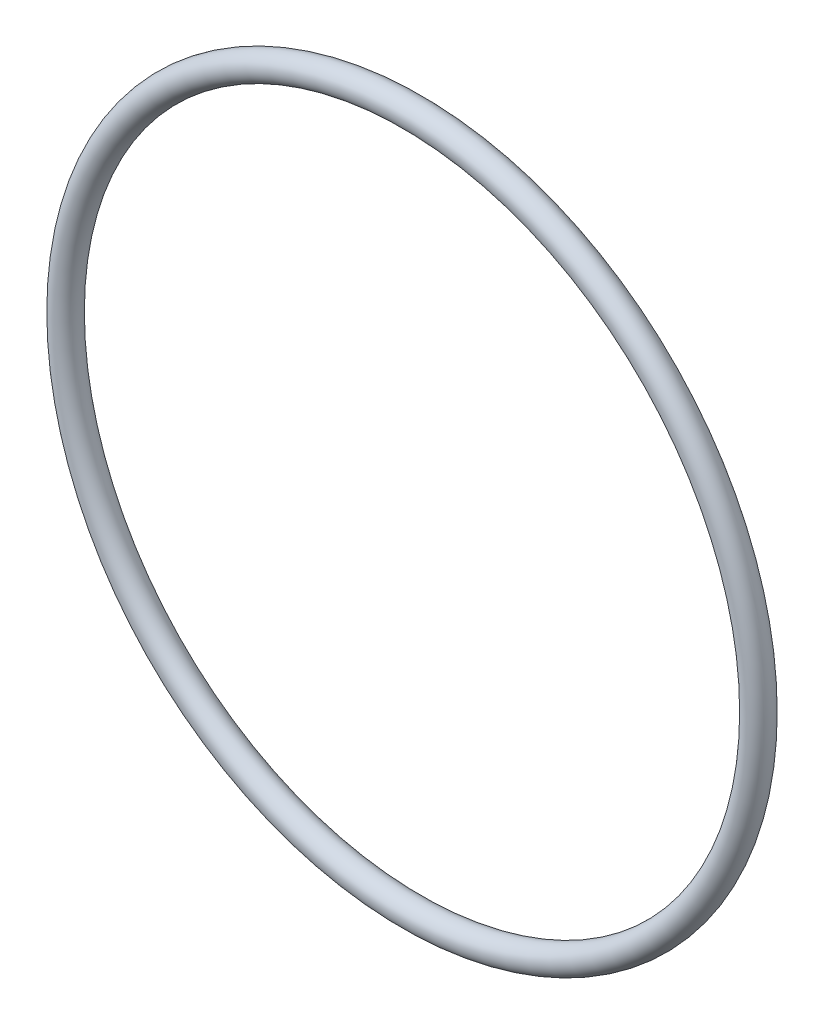
ISO-10303-21;
HEADER;
FILE_DESCRIPTION(('STEP AP214'),'2;1');
FILE_NAME('part.step','',(''),(''),'','','');
FILE_SCHEMA(('AUTOMOTIVE_DESIGN { 1 0 10303 214 1 1 1 1 }'));
ENDSEC;
DATA;
#1=APPLICATION_CONTEXT('core data for automotive mechanical design processes');
#2=APPLICATION_PROTOCOL_DEFINITION('international standard','automotive_design',2000,#1);
#3=PRODUCT_CONTEXT('',#1,'mechanical');
#4=PRODUCT('Part','Part','',(#3));
#5=PRODUCT_RELATED_PRODUCT_CATEGORY('part','',(#4));
#6=PRODUCT_DEFINITION_FORMATION('','',#4);
#7=PRODUCT_DEFINITION_CONTEXT('part definition',#1,'design');
#8=PRODUCT_DEFINITION('design','',#6,#7);
#9=PRODUCT_DEFINITION_SHAPE('','',#8);
#10=(LENGTH_UNIT() NAMED_UNIT(*) SI_UNIT(.MILLI.,.METRE.));
#11=(NAMED_UNIT(*) PLANE_ANGLE_UNIT() SI_UNIT($,.RADIAN.));
#12=(NAMED_UNIT(*) SI_UNIT($,.STERADIAN.) SOLID_ANGLE_UNIT());
#13=UNCERTAINTY_MEASURE_WITH_UNIT(LENGTH_MEASURE(1.E-05),#10,'distance_accuracy_value','');
#14=(GEOMETRIC_REPRESENTATION_CONTEXT(3) GLOBAL_UNCERTAINTY_ASSIGNED_CONTEXT((#13)) GLOBAL_UNIT_ASSIGNED_CONTEXT((#10,
#11,#12)) REPRESENTATION_CONTEXT('',''));
#15=CARTESIAN_POINT('',(0.,0.,0.));
#16=DIRECTION('',(0.,0.,1.));
#17=DIRECTION('',(1.,0.,0.));
#18=AXIS2_PLACEMENT_3D('',#15,#16,#17);
#19=CARTESIAN_POINT('',(0.,0.,0.));
#20=DIRECTION('',(0.,0.,1.));
#21=DIRECTION('',(1.,0.,0.));
#22=AXIS2_PLACEMENT_3D('',#19,#20,#21);
#23=TOROIDAL_SURFACE('',#22,46.0121,1.76530000000001);
#24=CARTESIAN_POINT('',(47.7774,0.,0.));
#25=VERTEX_POINT('',#24);
#26=VERTEX_LOOP('',#25);
#27=FACE_BOUND('',#26,.T.);
#28=ADVANCED_FACE('F33',(#27),#23,.T.);
#29=CLOSED_SHELL('',(#28));
#30=MANIFOLD_SOLID_BREP('B2',#29);
#31=ADVANCED_BREP_SHAPE_REPRESENTATION('',(#18,#30),#14);
#32=SHAPE_DEFINITION_REPRESENTATION(#9,#31);
ENDSEC;
END-ISO-10303-21;
